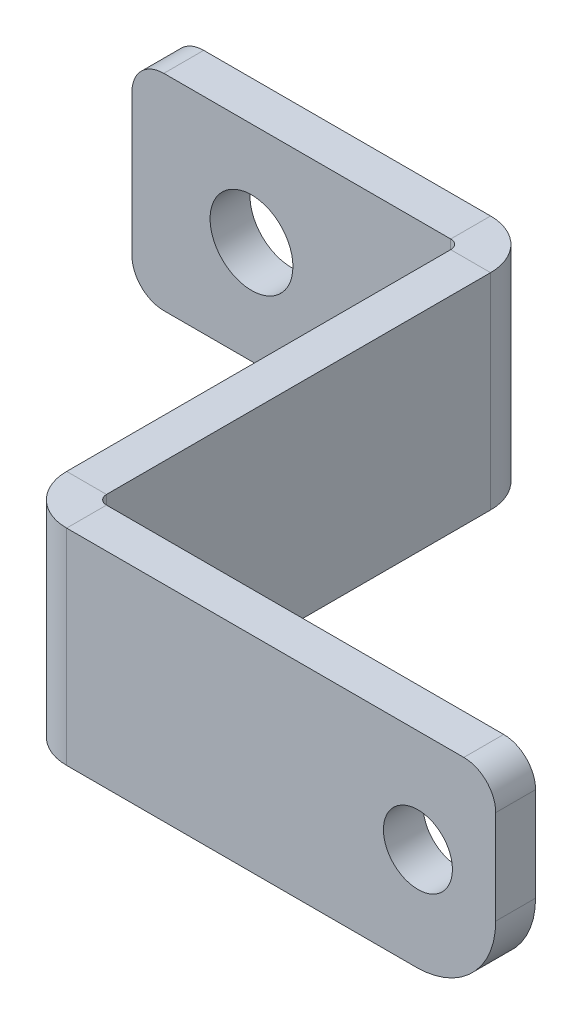
ISO-10303-21;
HEADER;
FILE_DESCRIPTION(('STEP AP214'),'2;1');
FILE_NAME('part.step','',(''),(''),'','','');
FILE_SCHEMA(('AUTOMOTIVE_DESIGN { 1 0 10303 214 1 1 1 1 }'));
ENDSEC;
DATA;
#1=APPLICATION_CONTEXT('core data for automotive mechanical design processes');
#2=APPLICATION_PROTOCOL_DEFINITION('international standard','automotive_design',2000,#1);
#3=PRODUCT_CONTEXT('',#1,'mechanical');
#4=PRODUCT('Part','Part','',(#3));
#5=PRODUCT_RELATED_PRODUCT_CATEGORY('part','',(#4));
#6=PRODUCT_DEFINITION_FORMATION('','',#4);
#7=PRODUCT_DEFINITION_CONTEXT('part definition',#1,'design');
#8=PRODUCT_DEFINITION('design','',#6,#7);
#9=PRODUCT_DEFINITION_SHAPE('','',#8);
#10=(LENGTH_UNIT() NAMED_UNIT(*) SI_UNIT(.MILLI.,.METRE.));
#11=(NAMED_UNIT(*) PLANE_ANGLE_UNIT() SI_UNIT($,.RADIAN.));
#12=(NAMED_UNIT(*) SI_UNIT($,.STERADIAN.) SOLID_ANGLE_UNIT());
#13=UNCERTAINTY_MEASURE_WITH_UNIT(LENGTH_MEASURE(1.E-05),#10,'distance_accuracy_value','');
#14=(GEOMETRIC_REPRESENTATION_CONTEXT(3) GLOBAL_UNCERTAINTY_ASSIGNED_CONTEXT((#13)) GLOBAL_UNIT_ASSIGNED_CONTEXT((#10,
#11,#12)) REPRESENTATION_CONTEXT('',''));
#15=CARTESIAN_POINT('',(0.,0.,0.));
#16=DIRECTION('',(0.,0.,1.));
#17=DIRECTION('',(1.,0.,0.));
#18=AXIS2_PLACEMENT_3D('',#15,#16,#17);
#19=CARTESIAN_POINT('',(65.8241,-45.5626000012021,0.));
#20=DIRECTION('',(0.,1.,0.));
#21=DIRECTION('',(0.,0.,1.));
#22=AXIS2_PLACEMENT_3D('',#19,#20,#21);
#23=PLANE('',#22);
#24=DIRECTION('',(-1.,0.,0.));
#25=VECTOR('',#24,1.);
#26=CARTESIAN_POINT('',(65.8241000000001,-45.5626000012021,31.3413));
#27=LINE('',#26,#25);
#28=CARTESIAN_POINT('',(65.8241000000001,-45.5626000012021,31.3413));
#29=VERTEX_POINT('',#28);
#30=CARTESIAN_POINT('',(62.6491000000001,-45.5626000012021,31.3413));
#31=VERTEX_POINT('',#30);
#32=EDGE_CURVE('E226',#29,#31,#27,.T.);
#33=ORIENTED_EDGE('',*,*,#32,.T.);
#34=DIRECTION('',(0.,0.,1.));
#35=VECTOR('',#34,1.);
#36=CARTESIAN_POINT('',(62.6491,-45.5626000012021,0.));
#37=LINE('',#36,#35);
#38=CARTESIAN_POINT('',(62.6491,-45.562600001202,0.736599999999997));
#39=VERTEX_POINT('',#38);
#40=EDGE_CURVE('E255',#31,#39,#37,.F.);
#41=ORIENTED_EDGE('',*,*,#40,.T.);
#42=DIRECTION('',(-1.,0.,0.));
#43=VECTOR('',#42,1.);
#44=CARTESIAN_POINT('',(65.8241,-45.5626000012021,0.736599999999986));
#45=LINE('',#44,#43);
#46=CARTESIAN_POINT('',(65.8241,-45.562600001202,0.736599999999986));
#47=VERTEX_POINT('',#46);
#48=EDGE_CURVE('E240',#39,#47,#45,.F.);
#49=ORIENTED_EDGE('',*,*,#48,.T.);
#50=DIRECTION('',(0.,0.,-1.));
#51=VECTOR('',#50,1.);
#52=CARTESIAN_POINT('',(65.8241,-45.5626000012021,-2.35221769799136E-13));
#53=LINE('',#52,#51);
#54=EDGE_CURVE('E248',#29,#47,#53,.T.);
#55=ORIENTED_EDGE('',*,*,#54,.F.);
#56=EDGE_LOOP('',(#33,#41,#49,#55));
#57=FACE_BOUND('',#56,.T.);
#58=ADVANCED_FACE('F60',(#57),#23,.F.);
#59=CARTESIAN_POINT('',(65.8241000000001,-29.1846000012021,32.0779));
#60=DIRECTION('',(0.,-1.,0.));
#61=DIRECTION('',(0.,0.,-1.));
#62=AXIS2_PLACEMENT_3D('',#59,#60,#61);
#63=PLANE('',#62);
#64=DIRECTION('',(-1.,0.,0.));
#65=VECTOR('',#64,1.);
#66=CARTESIAN_POINT('',(65.8241000000001,-29.1846000012021,31.3413));
#67=LINE('',#66,#65);
#68=CARTESIAN_POINT('',(65.8241000000001,-29.1846000012021,31.3413));
#69=VERTEX_POINT('',#68);
#70=CARTESIAN_POINT('',(62.6491000000001,-29.1846000012021,31.3413));
#71=VERTEX_POINT('',#70);
#72=EDGE_CURVE('E236',#69,#71,#67,.T.);
#73=ORIENTED_EDGE('',*,*,#72,.F.);
#74=DIRECTION('',(0.,0.,1.));
#75=VECTOR('',#74,1.);
#76=CARTESIAN_POINT('',(65.8241,-29.1846000012021,-2.22209432055311E-13));
#77=LINE('',#76,#75);
#78=CARTESIAN_POINT('',(65.8241,-29.1846000012021,0.736599999999986));
#79=VERTEX_POINT('',#78);
#80=EDGE_CURVE('E243',#79,#69,#77,.T.);
#81=ORIENTED_EDGE('',*,*,#80,.F.);
#82=DIRECTION('',(-1.,0.,0.));
#83=VECTOR('',#82,1.);
#84=CARTESIAN_POINT('',(62.6491,-29.1846000012021,0.736599999999997));
#85=LINE('',#84,#83);
#86=CARTESIAN_POINT('',(62.6491,-29.1846000012021,0.736599999999997));
#87=VERTEX_POINT('',#86);
#88=EDGE_CURVE('E262',#87,#79,#85,.F.);
#89=ORIENTED_EDGE('',*,*,#88,.F.);
#90=DIRECTION('',(0.,0.,-1.));
#91=VECTOR('',#90,1.);
#92=CARTESIAN_POINT('',(62.6491000000001,-29.1846000012021,32.0779));
#93=LINE('',#92,#91);
#94=EDGE_CURVE('E251',#87,#71,#93,.F.);
#95=ORIENTED_EDGE('',*,*,#94,.T.);
#96=EDGE_LOOP('',(#73,#81,#89,#95));
#97=FACE_BOUND('',#96,.T.);
#98=ADVANCED_FACE('F427',(#97),#63,.F.);
#99=CARTESIAN_POINT('',(65.8241,0.,-2.25365948582831E-13));
#100=DIRECTION('',(-1.,0.,0.));
#101=DIRECTION('',(0.,0.,1.));
#102=AXIS2_PLACEMENT_3D('',#99,#100,#101);
#103=PLANE('',#102);
#104=DIRECTION('',(0.,-1.,0.));
#105=VECTOR('',#104,1.);
#106=CARTESIAN_POINT('',(65.8241000000001,-45.5626000012021,31.3413));
#107=LINE('',#106,#105);
#108=EDGE_CURVE('E231',#29,#69,#107,.F.);
#109=ORIENTED_EDGE('',*,*,#108,.F.);
#110=ORIENTED_EDGE('',*,*,#54,.T.);
#111=DIRECTION('',(0.,1.,0.));
#112=VECTOR('',#111,1.);
#113=CARTESIAN_POINT('',(65.8241,-45.5626000012021,0.736599999999986));
#114=LINE('',#113,#112);
#115=EDGE_CURVE('E258',#79,#47,#114,.F.);
#116=ORIENTED_EDGE('',*,*,#115,.F.);
#117=ORIENTED_EDGE('',*,*,#80,.T.);
#118=EDGE_LOOP('',(#109,#110,#116,#117));
#119=FACE_BOUND('',#118,.T.);
#120=ADVANCED_FACE('F433',(#119),#103,.F.);
#121=CARTESIAN_POINT('',(62.6491,0.,-2.14280495332004E-13));
#122=DIRECTION('',(-1.,0.,0.));
#123=DIRECTION('',(0.,0.,1.));
#124=AXIS2_PLACEMENT_3D('',#121,#122,#123);
#125=PLANE('',#124);
#126=ORIENTED_EDGE('',*,*,#40,.F.);
#127=DIRECTION('',(0.,-1.,0.));
#128=VECTOR('',#127,1.);
#129=CARTESIAN_POINT('',(62.6491000000001,-45.5626000012021,31.3413));
#130=LINE('',#129,#128);
#131=EDGE_CURVE('E181',#31,#71,#130,.F.);
#132=ORIENTED_EDGE('',*,*,#131,.T.);
#133=ORIENTED_EDGE('',*,*,#94,.F.);
#134=DIRECTION('',(0.,1.,0.));
#135=VECTOR('',#134,1.);
#136=CARTESIAN_POINT('',(62.6491,-45.5626000012021,0.736599999999997));
#137=LINE('',#136,#135);
#138=EDGE_CURVE('E266',#39,#87,#137,.T.);
#139=ORIENTED_EDGE('',*,*,#138,.F.);
#140=EDGE_LOOP('',(#126,#132,#133,#139));
#141=FACE_BOUND('',#140,.T.);
#142=ADVANCED_FACE('F478',(#141),#125,.T.);
#143=CARTESIAN_POINT('',(36.5125,-29.1846000012021,-3.175));
#144=DIRECTION('',(0.,1.,0.));
#145=DIRECTION('',(0.,0.,1.));
#146=AXIS2_PLACEMENT_3D('',#143,#144,#145);
#147=PLANE('',#146);
#148=DIRECTION('',(-1.,0.,0.));
#149=VECTOR('',#148,1.);
#150=CARTESIAN_POINT('',(36.5125,-29.1846000012021,-3.175));
#151=LINE('',#150,#149);
#152=CARTESIAN_POINT('',(61.9125,-29.1846000012021,-3.175));
#153=VERTEX_POINT('',#152);
#154=CARTESIAN_POINT('',(39.0525,-29.1846000012021,-3.175));
#155=VERTEX_POINT('',#154);
#156=EDGE_CURVE('E296',#153,#155,#151,.T.);
#157=ORIENTED_EDGE('',*,*,#156,.T.);
#158=DIRECTION('',(0.,0.,1.));
#159=VECTOR('',#158,1.);
#160=CARTESIAN_POINT('',(39.0525,-29.1846000012021,-3.175));
#161=LINE('',#160,#159);
#162=CARTESIAN_POINT('',(39.0525,-29.1846000012021,0.));
#163=VERTEX_POINT('',#162);
#164=EDGE_CURVE('E355',#155,#163,#161,.T.);
#165=ORIENTED_EDGE('',*,*,#164,.T.);
#166=DIRECTION('',(-1.,0.,0.));
#167=VECTOR('',#166,1.);
#168=CARTESIAN_POINT('',(36.5125,-29.1846000012021,0.));
#169=LINE('',#168,#167);
#170=CARTESIAN_POINT('',(61.9125,-29.1846000012021,0.));
#171=VERTEX_POINT('',#170);
#172=EDGE_CURVE('E295',#171,#163,#169,.T.);
#173=ORIENTED_EDGE('',*,*,#172,.F.);
#174=DIRECTION('',(0.,0.,1.));
#175=VECTOR('',#174,1.);
#176=CARTESIAN_POINT('',(61.9125,-29.1846000012021,-3.175));
#177=LINE('',#176,#175);
#178=EDGE_CURVE('E326',#153,#171,#177,.T.);
#179=ORIENTED_EDGE('',*,*,#178,.F.);
#180=EDGE_LOOP('',(#157,#165,#173,#179));
#181=FACE_BOUND('',#180,.T.);
#182=ADVANCED_FACE('F471',(#181),#147,.T.);
#183=CARTESIAN_POINT('',(52.8905,-45.5626000012021,-3.175));
#184=DIRECTION('',(0.,-1.,0.));
#185=DIRECTION('',(1.,0.,0.));
#186=AXIS2_PLACEMENT_3D('',#183,#184,#185);
#187=PLANE('',#186);
#188=DIRECTION('',(1.,0.,0.));
#189=VECTOR('',#188,1.);
#190=CARTESIAN_POINT('',(52.8905,-45.5626000012021,0.));
#191=LINE('',#190,#189);
#192=CARTESIAN_POINT('',(39.0525,-45.5626000012021,0.));
#193=VERTEX_POINT('',#192);
#194=CARTESIAN_POINT('',(61.9125,-45.5626000012021,0.));
#195=VERTEX_POINT('',#194);
#196=EDGE_CURVE('E320',#193,#195,#191,.T.);
#197=ORIENTED_EDGE('',*,*,#196,.F.);
#198=DIRECTION('',(0.,0.,1.));
#199=VECTOR('',#198,1.);
#200=CARTESIAN_POINT('',(39.0525,-45.5626000012021,-3.175));
#201=LINE('',#200,#199);
#202=CARTESIAN_POINT('',(39.0525,-45.5626000012021,-3.175));
#203=VERTEX_POINT('',#202);
#204=EDGE_CURVE('E346',#193,#203,#201,.F.);
#205=ORIENTED_EDGE('',*,*,#204,.T.);
#206=DIRECTION('',(1.,0.,0.));
#207=VECTOR('',#206,1.);
#208=CARTESIAN_POINT('',(52.8905,-45.5626000012021,-3.175));
#209=LINE('',#208,#207);
#210=CARTESIAN_POINT('',(61.9125,-45.5626000012021,-3.175));
#211=VERTEX_POINT('',#210);
#212=EDGE_CURVE('E305',#203,#211,#209,.T.);
#213=ORIENTED_EDGE('',*,*,#212,.T.);
#214=DIRECTION('',(0.,0.,1.));
#215=VECTOR('',#214,1.);
#216=CARTESIAN_POINT('',(61.9125,-45.5626000012021,-3.175));
#217=LINE('',#216,#215);
#218=EDGE_CURVE('E312',#211,#195,#217,.T.);
#219=ORIENTED_EDGE('',*,*,#218,.T.);
#220=EDGE_LOOP('',(#197,#205,#213,#219));
#221=FACE_BOUND('',#220,.T.);
#222=ADVANCED_FACE('F468',(#221),#187,.T.);
#223=CARTESIAN_POINT('',(36.5125,-29.1846000012021,-3.175));
#224=DIRECTION('',(-1.,0.,0.));
#225=DIRECTION('',(0.,-1.,0.));
#226=AXIS2_PLACEMENT_3D('',#223,#224,#225);
#227=PLANE('',#226);
#228=DIRECTION('',(0.,-1.,0.));
#229=VECTOR('',#228,1.);
#230=CARTESIAN_POINT('',(36.5125,-29.1846000012021,-3.175));
#231=LINE('',#230,#229);
#232=CARTESIAN_POINT('',(36.5125,-31.7246000012021,-3.175));
#233=VERTEX_POINT('',#232);
#234=CARTESIAN_POINT('',(36.5125,-43.0226000012021,-3.175));
#235=VERTEX_POINT('',#234);
#236=EDGE_CURVE('E300',#233,#235,#231,.T.);
#237=ORIENTED_EDGE('',*,*,#236,.T.);
#238=DIRECTION('',(0.,0.,1.));
#239=VECTOR('',#238,1.);
#240=CARTESIAN_POINT('',(36.5125,-43.0226000012021,-3.175));
#241=LINE('',#240,#239);
#242=CARTESIAN_POINT('',(36.5125,-43.0226000012021,0.));
#243=VERTEX_POINT('',#242);
#244=EDGE_CURVE('E336',#235,#243,#241,.T.);
#245=ORIENTED_EDGE('',*,*,#244,.T.);
#246=DIRECTION('',(0.,-1.,0.));
#247=VECTOR('',#246,1.);
#248=CARTESIAN_POINT('',(36.5125,-29.1846000012021,0.));
#249=LINE('',#248,#247);
#250=CARTESIAN_POINT('',(36.5125,-31.7246000012021,0.));
#251=VERTEX_POINT('',#250);
#252=EDGE_CURVE('E316',#251,#243,#249,.T.);
#253=ORIENTED_EDGE('',*,*,#252,.F.);
#254=DIRECTION('',(0.,0.,1.));
#255=VECTOR('',#254,1.);
#256=CARTESIAN_POINT('',(36.5125,-31.7246000012021,-3.175));
#257=LINE('',#256,#255);
#258=EDGE_CURVE('E330',#251,#233,#257,.F.);
#259=ORIENTED_EDGE('',*,*,#258,.T.);
#260=EDGE_LOOP('',(#237,#245,#253,#259));
#261=FACE_BOUND('',#260,.T.);
#262=ADVANCED_FACE('F463',(#261),#227,.T.);
#263=CARTESIAN_POINT('',(0.,0.,-3.175));
#264=DIRECTION('',(0.,0.,1.));
#265=DIRECTION('',(1.,0.,0.));
#266=AXIS2_PLACEMENT_3D('',#263,#264,#265);
#267=PLANE('',#266);
#268=CARTESIAN_POINT('',(46.0375,-37.3736000012021,-3.175));
#269=DIRECTION('',(0.,0.,1.));
#270=DIRECTION('',(1.,0.,0.));
#271=AXIS2_PLACEMENT_3D('',#268,#269,#270);
#272=CIRCLE('',#271,3.3);
#273=CARTESIAN_POINT('',(49.3375,-37.3736000012021,-3.175));
#274=VERTEX_POINT('',#273);
#275=EDGE_CURVE('E291',#274,#274,#272,.T.);
#276=ORIENTED_EDGE('',*,*,#275,.T.);
#277=EDGE_LOOP('',(#276));
#278=FACE_BOUND('',#277,.T.);
#279=ORIENTED_EDGE('',*,*,#212,.F.);
#280=CARTESIAN_POINT('',(39.0525,-43.0226000012021,-3.175));
#281=DIRECTION('',(0.,0.,1.));
#282=DIRECTION('',(1.,0.,0.));
#283=AXIS2_PLACEMENT_3D('',#280,#281,#282);
#284=CIRCLE('',#283,2.54);
#285=EDGE_CURVE('E352',#203,#235,#284,.F.);
#286=ORIENTED_EDGE('',*,*,#285,.T.);
#287=ORIENTED_EDGE('',*,*,#236,.F.);
#288=CARTESIAN_POINT('',(39.0525,-31.7246000012021,-3.175));
#289=DIRECTION('',(0.,0.,1.));
#290=DIRECTION('',(1.,0.,0.));
#291=AXIS2_PLACEMENT_3D('',#288,#289,#290);
#292=CIRCLE('',#291,2.54);
#293=EDGE_CURVE('E349',#233,#155,#292,.F.);
#294=ORIENTED_EDGE('',*,*,#293,.T.);
#295=ORIENTED_EDGE('',*,*,#156,.F.);
#296=DIRECTION('',(0.,1.,0.));
#297=VECTOR('',#296,1.);
#298=CARTESIAN_POINT('',(61.9125,-45.5626000012021,-3.175));
#299=LINE('',#298,#297);
#300=EDGE_CURVE('E308',#211,#153,#299,.T.);
#301=ORIENTED_EDGE('',*,*,#300,.F.);
#302=EDGE_LOOP('',(#279,#286,#287,#294,#295,#301));
#303=FACE_BOUND('',#302,.T.);
#304=ADVANCED_FACE('F460',(#278,#303),#267,.F.);
#305=CARTESIAN_POINT('',(0.,0.,0.));
#306=DIRECTION('',(0.,0.,1.));
#307=DIRECTION('',(1.,0.,0.));
#308=AXIS2_PLACEMENT_3D('',#305,#306,#307);
#309=PLANE('',#308);
#310=CARTESIAN_POINT('',(46.0375,-37.3736000012021,0.));
#311=DIRECTION('',(0.,0.,1.));
#312=DIRECTION('',(1.,0.,0.));
#313=AXIS2_PLACEMENT_3D('',#310,#311,#312);
#314=CIRCLE('',#313,3.3);
#315=CARTESIAN_POINT('',(49.3375,-37.3736000012021,0.));
#316=VERTEX_POINT('',#315);
#317=EDGE_CURVE('E276',#316,#316,#314,.T.);
#318=ORIENTED_EDGE('',*,*,#317,.F.);
#319=EDGE_LOOP('',(#318));
#320=FACE_BOUND('',#319,.T.);
#321=ORIENTED_EDGE('',*,*,#252,.T.);
#322=CARTESIAN_POINT('',(39.0525,-43.0226000012021,0.));
#323=DIRECTION('',(0.,0.,1.));
#324=DIRECTION('',(1.,0.,0.));
#325=AXIS2_PLACEMENT_3D('',#322,#323,#324);
#326=CIRCLE('',#325,2.54);
#327=EDGE_CURVE('E343',#243,#193,#326,.T.);
#328=ORIENTED_EDGE('',*,*,#327,.T.);
#329=ORIENTED_EDGE('',*,*,#196,.T.);
#330=DIRECTION('',(0.,1.,0.));
#331=VECTOR('',#330,1.);
#332=CARTESIAN_POINT('',(61.9125,-45.5626000012021,0.));
#333=LINE('',#332,#331);
#334=EDGE_CURVE('E301',#195,#171,#333,.T.);
#335=ORIENTED_EDGE('',*,*,#334,.T.);
#336=ORIENTED_EDGE('',*,*,#172,.T.);
#337=CARTESIAN_POINT('',(39.0525,-31.7246000012021,0.));
#338=DIRECTION('',(0.,0.,1.));
#339=DIRECTION('',(1.,0.,0.));
#340=AXIS2_PLACEMENT_3D('',#337,#338,#339);
#341=CIRCLE('',#340,2.54);
#342=EDGE_CURVE('E340',#163,#251,#341,.T.);
#343=ORIENTED_EDGE('',*,*,#342,.T.);
#344=EDGE_LOOP('',(#321,#328,#329,#335,#336,#343));
#345=FACE_BOUND('',#344,.T.);
#346=ADVANCED_FACE('F458',(#320,#345),#309,.T.);
#347=CARTESIAN_POINT('',(46.0375,-37.3736000012021,0.));
#348=DIRECTION('',(0.,0.,1.));
#349=DIRECTION('',(1.,0.,0.));
#350=AXIS2_PLACEMENT_3D('',#347,#348,#349);
#351=CYLINDRICAL_SURFACE('',#350,3.3);
#352=ORIENTED_EDGE('',*,*,#275,.F.);
#353=EDGE_LOOP('',(#352));
#354=FACE_BOUND('',#353,.T.);
#355=ORIENTED_EDGE('',*,*,#317,.T.);
#356=EDGE_LOOP('',(#355));
#357=FACE_BOUND('',#356,.T.);
#358=ADVANCED_FACE('F451',(#354,#357),#351,.F.);
#359=CARTESIAN_POINT('',(61.9125,-45.562600001202,0.7366));
#360=DIRECTION('',(0.,-1.,0.));
#361=DIRECTION('',(0.,0.,-1.));
#362=AXIS2_PLACEMENT_3D('',#359,#360,#361);
#363=PLANE('',#362);
#364=ORIENTED_EDGE('',*,*,#48,.F.);
#365=CARTESIAN_POINT('',(61.9125,-45.562600001202,0.7366));
#366=DIRECTION('',(0.,1.,0.));
#367=DIRECTION('',(0.,0.,1.));
#368=AXIS2_PLACEMENT_3D('',#365,#366,#367);
#369=CIRCLE('',#368,0.736599999999997);
#370=EDGE_CURVE('E281',#195,#39,#369,.F.);
#371=ORIENTED_EDGE('',*,*,#370,.F.);
#372=ORIENTED_EDGE('',*,*,#218,.F.);
#373=CARTESIAN_POINT('',(61.9125,-45.562600001202,0.7366));
#374=DIRECTION('',(0.,1.,0.));
#375=DIRECTION('',(0.,0.,1.));
#376=AXIS2_PLACEMENT_3D('',#373,#374,#375);
#377=CIRCLE('',#376,3.9116);
#378=EDGE_CURVE('E272',#211,#47,#377,.F.);
#379=ORIENTED_EDGE('',*,*,#378,.T.);
#380=EDGE_LOOP('',(#364,#371,#372,#379));
#381=FACE_BOUND('',#380,.T.);
#382=ADVANCED_FACE('F448',(#381),#363,.T.);
#383=CARTESIAN_POINT('',(61.9125,-29.1846000012021,0.7366));
#384=DIRECTION('',(0.,-1.,0.));
#385=DIRECTION('',(0.,0.,-1.));
#386=AXIS2_PLACEMENT_3D('',#383,#384,#385);
#387=PLANE('',#386);
#388=CARTESIAN_POINT('',(61.9125,-29.1846000012021,0.7366));
#389=DIRECTION('',(0.,1.,0.));
#390=DIRECTION('',(0.,0.,1.));
#391=AXIS2_PLACEMENT_3D('',#388,#389,#390);
#392=CIRCLE('',#391,0.736599999999997);
#393=EDGE_CURVE('E247',#87,#171,#392,.T.);
#394=ORIENTED_EDGE('',*,*,#393,.F.);
#395=ORIENTED_EDGE('',*,*,#88,.T.);
#396=CARTESIAN_POINT('',(61.9125,-29.1846000012021,0.7366));
#397=DIRECTION('',(0.,1.,0.));
#398=DIRECTION('',(0.,0.,1.));
#399=AXIS2_PLACEMENT_3D('',#396,#397,#398);
#400=CIRCLE('',#399,3.9116);
#401=EDGE_CURVE('E277',#79,#153,#400,.T.);
#402=ORIENTED_EDGE('',*,*,#401,.T.);
#403=ORIENTED_EDGE('',*,*,#178,.T.);
#404=EDGE_LOOP('',(#394,#395,#402,#403));
#405=FACE_BOUND('',#404,.T.);
#406=ADVANCED_FACE('F442',(#405),#387,.F.);
#407=CARTESIAN_POINT('',(61.9125,-29.1846000012021,0.7366));
#408=DIRECTION('',(0.,1.,0.));
#409=DIRECTION('',(1.,0.,0.));
#410=AXIS2_PLACEMENT_3D('',#407,#408,#409);
#411=CYLINDRICAL_SURFACE('',#410,3.9116);
#412=ORIENTED_EDGE('',*,*,#300,.T.);
#413=ORIENTED_EDGE('',*,*,#401,.F.);
#414=ORIENTED_EDGE('',*,*,#115,.T.);
#415=ORIENTED_EDGE('',*,*,#378,.F.);
#416=EDGE_LOOP('',(#412,#413,#414,#415));
#417=FACE_BOUND('',#416,.T.);
#418=ADVANCED_FACE('F438',(#417),#411,.T.);
#419=CARTESIAN_POINT('',(61.9125,-29.1846000012021,0.7366));
#420=DIRECTION('',(0.,1.,0.));
#421=DIRECTION('',(1.,0.,0.));
#422=AXIS2_PLACEMENT_3D('',#419,#420,#421);
#423=CYLINDRICAL_SURFACE('',#422,0.736599999999997);
#424=ORIENTED_EDGE('',*,*,#334,.F.);
#425=ORIENTED_EDGE('',*,*,#370,.T.);
#426=ORIENTED_EDGE('',*,*,#138,.T.);
#427=ORIENTED_EDGE('',*,*,#393,.T.);
#428=EDGE_LOOP('',(#424,#425,#426,#427));
#429=FACE_BOUND('',#428,.T.);
#430=ADVANCED_FACE('F441',(#429),#423,.F.);
#431=CARTESIAN_POINT('',(66.5607000000001,-29.1846000012021,31.3413));
#432=DIRECTION('',(0.,1.,0.));
#433=DIRECTION('',(0.,0.,1.));
#434=AXIS2_PLACEMENT_3D('',#431,#432,#433);
#435=PLANE('',#434);
#436=DIRECTION('',(0.,0.,1.));
#437=VECTOR('',#436,1.);
#438=CARTESIAN_POINT('',(66.5607000000001,-29.1846000012021,32.0779));
#439=LINE('',#438,#437);
#440=CARTESIAN_POINT('',(66.5607000000001,-29.1846000012021,32.0779));
#441=VERTEX_POINT('',#440);
#442=CARTESIAN_POINT('',(66.5607000000001,-29.1846000012021,35.2529));
#443=VERTEX_POINT('',#442);
#444=EDGE_CURVE('E397',#441,#443,#439,.T.);
#445=ORIENTED_EDGE('',*,*,#444,.F.);
#446=CARTESIAN_POINT('',(66.5607000000001,-29.1846000012021,31.3413));
#447=DIRECTION('',(0.,-1.,0.));
#448=DIRECTION('',(0.,0.,-1.));
#449=AXIS2_PLACEMENT_3D('',#446,#447,#448);
#450=CIRCLE('',#449,0.736599999999997);
#451=EDGE_CURVE('E185',#69,#441,#450,.F.);
#452=ORIENTED_EDGE('',*,*,#451,.F.);
#453=ORIENTED_EDGE('',*,*,#72,.T.);
#454=CARTESIAN_POINT('',(66.5607000000001,-29.1846000012021,31.3413));
#455=DIRECTION('',(0.,-1.,0.));
#456=DIRECTION('',(0.,0.,-1.));
#457=AXIS2_PLACEMENT_3D('',#454,#455,#456);
#458=CIRCLE('',#457,3.9116);
#459=EDGE_CURVE('E224',#71,#443,#458,.F.);
#460=ORIENTED_EDGE('',*,*,#459,.T.);
#461=EDGE_LOOP('',(#445,#452,#453,#460));
#462=FACE_BOUND('',#461,.T.);
#463=ADVANCED_FACE('F446',(#462),#435,.T.);
#464=CARTESIAN_POINT('',(66.5607000000001,-45.5626000012021,31.3413));
#465=DIRECTION('',(0.,1.,0.));
#466=DIRECTION('',(0.,0.,1.));
#467=AXIS2_PLACEMENT_3D('',#464,#465,#466);
#468=PLANE('',#467);
#469=CARTESIAN_POINT('',(66.5607000000001,-45.5626000012021,31.3413));
#470=DIRECTION('',(0.,-1.,0.));
#471=DIRECTION('',(0.,0.,-1.));
#472=AXIS2_PLACEMENT_3D('',#469,#470,#471);
#473=CIRCLE('',#472,0.736599999999997);
#474=CARTESIAN_POINT('',(66.5607000000001,-45.5626000012021,32.0779));
#475=VERTEX_POINT('',#474);
#476=EDGE_CURVE('E192',#475,#29,#473,.T.);
#477=ORIENTED_EDGE('',*,*,#476,.F.);
#478=DIRECTION('',(0.,0.,1.));
#479=VECTOR('',#478,1.);
#480=CARTESIAN_POINT('',(66.5607000000001,-45.5626000012021,32.0779));
#481=LINE('',#480,#479);
#482=CARTESIAN_POINT('',(66.5607000000001,-45.5626000012021,35.2529));
#483=VERTEX_POINT('',#482);
#484=EDGE_CURVE('E189',#475,#483,#481,.T.);
#485=ORIENTED_EDGE('',*,*,#484,.T.);
#486=CARTESIAN_POINT('',(66.5607000000001,-45.5626000012021,31.3413));
#487=DIRECTION('',(0.,-1.,0.));
#488=DIRECTION('',(0.,0.,-1.));
#489=AXIS2_PLACEMENT_3D('',#486,#487,#488);
#490=CIRCLE('',#489,3.9116);
#491=EDGE_CURVE('E174',#483,#31,#490,.T.);
#492=ORIENTED_EDGE('',*,*,#491,.T.);
#493=ORIENTED_EDGE('',*,*,#32,.F.);
#494=EDGE_LOOP('',(#477,#485,#492,#493));
#495=FACE_BOUND('',#494,.T.);
#496=ADVANCED_FACE('F190',(#495),#468,.F.);
#497=CARTESIAN_POINT('',(66.5607000000001,-45.5626000012021,31.3413));
#498=DIRECTION('',(0.,-1.,0.));
#499=DIRECTION('',(0.,0.,1.));
#500=AXIS2_PLACEMENT_3D('',#497,#498,#499);
#501=CYLINDRICAL_SURFACE('',#500,3.9116);
#502=ORIENTED_EDGE('',*,*,#131,.F.);
#503=ORIENTED_EDGE('',*,*,#491,.F.);
#504=DIRECTION('',(0.,1.,0.));
#505=VECTOR('',#504,1.);
#506=CARTESIAN_POINT('',(66.5607000000001,0.,35.2529));
#507=LINE('',#506,#505);
#508=EDGE_CURVE('E178',#483,#443,#507,.T.);
#509=ORIENTED_EDGE('',*,*,#508,.T.);
#510=ORIENTED_EDGE('',*,*,#459,.F.);
#511=EDGE_LOOP('',(#502,#503,#509,#510));
#512=FACE_BOUND('',#511,.T.);
#513=ADVANCED_FACE('F176',(#512),#501,.T.);
#514=CARTESIAN_POINT('',(66.5607000000001,-45.5626000012021,31.3413));
#515=DIRECTION('',(0.,-1.,0.));
#516=DIRECTION('',(0.,0.,1.));
#517=AXIS2_PLACEMENT_3D('',#514,#515,#516);
#518=CYLINDRICAL_SURFACE('',#517,0.736599999999997);
#519=ORIENTED_EDGE('',*,*,#108,.T.);
#520=ORIENTED_EDGE('',*,*,#451,.T.);
#521=DIRECTION('',(0.,-1.,0.));
#522=VECTOR('',#521,1.);
#523=CARTESIAN_POINT('',(66.5607000000001,-29.1846000012021,32.0779));
#524=LINE('',#523,#522);
#525=EDGE_CURVE('E194',#441,#475,#524,.T.);
#526=ORIENTED_EDGE('',*,*,#525,.T.);
#527=ORIENTED_EDGE('',*,*,#476,.T.);
#528=EDGE_LOOP('',(#519,#520,#526,#527));
#529=FACE_BOUND('',#528,.T.);
#530=ADVANCED_FACE('F548',(#529),#518,.F.);
#531=CARTESIAN_POINT('',(65.8241000000001,-29.1846000012021,35.2529));
#532=DIRECTION('',(0.,-1.,0.));
#533=DIRECTION('',(0.,0.,-1.));
#534=AXIS2_PLACEMENT_3D('',#531,#532,#533);
#535=PLANE('',#534);
#536=DIRECTION('',(-1.,0.,0.));
#537=VECTOR('',#536,1.);
#538=CARTESIAN_POINT('',(65.8241000000001,-29.1846000012021,35.2529));
#539=LINE('',#538,#537);
#540=CARTESIAN_POINT('',(98.2091000000001,-29.1846000012021,35.2529));
#541=VERTEX_POINT('',#540);
#542=EDGE_CURVE('E201',#541,#443,#539,.T.);
#543=ORIENTED_EDGE('',*,*,#542,.F.);
#544=DIRECTION('',(0.,0.,-1.));
#545=VECTOR('',#544,1.);
#546=CARTESIAN_POINT('',(98.2091000000001,-29.1846000012021,35.2529));
#547=LINE('',#546,#545);
#548=CARTESIAN_POINT('',(98.2091000000001,-29.1846000012021,32.0779));
#549=VERTEX_POINT('',#548);
#550=EDGE_CURVE('E359',#541,#549,#547,.T.);
#551=ORIENTED_EDGE('',*,*,#550,.T.);
#552=DIRECTION('',(-1.,0.,0.));
#553=VECTOR('',#552,1.);
#554=CARTESIAN_POINT('',(65.8241000000001,-29.1846000012021,32.0779));
#555=LINE('',#554,#553);
#556=EDGE_CURVE('E203',#549,#441,#555,.T.);
#557=ORIENTED_EDGE('',*,*,#556,.T.);
#558=ORIENTED_EDGE('',*,*,#444,.T.);
#559=EDGE_LOOP('',(#543,#551,#557,#558));
#560=FACE_BOUND('',#559,.T.);
#561=ADVANCED_FACE('F395',(#560),#535,.F.);
#562=CARTESIAN_POINT('',(100.7491,-45.5626000012021,35.2529));
#563=DIRECTION('',(0.,1.,0.));
#564=DIRECTION('',(0.,0.,1.));
#565=AXIS2_PLACEMENT_3D('',#562,#563,#564);
#566=PLANE('',#565);
#567=DIRECTION('',(1.,0.,0.));
#568=VECTOR('',#567,1.);
#569=CARTESIAN_POINT('',(100.7491,-45.5626000012021,32.0779));
#570=LINE('',#569,#568);
#571=CARTESIAN_POINT('',(94.3991000000001,-45.5626000012021,32.0779));
#572=VERTEX_POINT('',#571);
#573=EDGE_CURVE('E217',#475,#572,#570,.T.);
#574=ORIENTED_EDGE('',*,*,#573,.T.);
#575=DIRECTION('',(0.,0.,-1.));
#576=VECTOR('',#575,1.);
#577=CARTESIAN_POINT('',(94.3991000000001,-45.5626000012021,35.2529));
#578=LINE('',#577,#576);
#579=CARTESIAN_POINT('',(94.3991000000001,-45.5626000012021,35.2529));
#580=VERTEX_POINT('',#579);
#581=EDGE_CURVE('E69',#572,#580,#578,.F.);
#582=ORIENTED_EDGE('',*,*,#581,.T.);
#583=DIRECTION('',(1.,0.,0.));
#584=VECTOR('',#583,1.);
#585=CARTESIAN_POINT('',(100.7491,-45.5626000012021,35.2529));
#586=LINE('',#585,#584);
#587=EDGE_CURVE('E198',#483,#580,#586,.T.);
#588=ORIENTED_EDGE('',*,*,#587,.F.);
#589=ORIENTED_EDGE('',*,*,#484,.F.);
#590=EDGE_LOOP('',(#574,#582,#588,#589));
#591=FACE_BOUND('',#590,.T.);
#592=ADVANCED_FACE('F205',(#591),#566,.F.);
#593=CARTESIAN_POINT('',(0.,0.,35.2529));
#594=DIRECTION('',(0.,0.,-1.));
#595=DIRECTION('',(-1.,0.,0.));
#596=AXIS2_PLACEMENT_3D('',#593,#594,#595);
#597=PLANE('',#596);
#598=CARTESIAN_POINT('',(94.5499000000038,-37.373600001202,35.2529));
#599=DIRECTION('',(0.,0.,1.));
#600=DIRECTION('',(1.,0.,0.));
#601=AXIS2_PLACEMENT_3D('',#598,#599,#600);
#602=CIRCLE('',#601,2.75);
#603=CARTESIAN_POINT('',(97.2999000000038,-37.373600001202,35.2529));
#604=VERTEX_POINT('',#603);
#605=EDGE_CURVE('E407',#604,#604,#602,.T.);
#606=ORIENTED_EDGE('',*,*,#605,.F.);
#607=EDGE_LOOP('',(#606));
#608=FACE_BOUND('',#607,.T.);
#609=ORIENTED_EDGE('',*,*,#587,.T.);
#610=CARTESIAN_POINT('',(94.3991000000001,-39.2126000012021,35.2529));
#611=DIRECTION('',(0.,0.,-1.));
#612=DIRECTION('',(-1.,0.,0.));
#613=AXIS2_PLACEMENT_3D('',#610,#611,#612);
#614=CIRCLE('',#613,6.35);
#615=CARTESIAN_POINT('',(100.7491,-39.2126000012021,35.2529));
#616=VERTEX_POINT('',#615);
#617=EDGE_CURVE('E13',#580,#616,#614,.F.);
#618=ORIENTED_EDGE('',*,*,#617,.T.);
#619=DIRECTION('',(0.,1.,0.));
#620=VECTOR('',#619,1.);
#621=CARTESIAN_POINT('',(100.7491,-29.1846000012021,35.2529));
#622=LINE('',#621,#620);
#623=CARTESIAN_POINT('',(100.7491,-31.7246000012021,35.2529));
#624=VERTEX_POINT('',#623);
#625=EDGE_CURVE('E207',#616,#624,#622,.T.);
#626=ORIENTED_EDGE('',*,*,#625,.T.);
#627=CARTESIAN_POINT('',(98.2091000000001,-31.7246000012021,35.2529));
#628=DIRECTION('',(0.,0.,-1.));
#629=DIRECTION('',(-1.,0.,0.));
#630=AXIS2_PLACEMENT_3D('',#627,#628,#629);
#631=CIRCLE('',#630,2.54);
#632=EDGE_CURVE('E371',#624,#541,#631,.F.);
#633=ORIENTED_EDGE('',*,*,#632,.T.);
#634=ORIENTED_EDGE('',*,*,#542,.T.);
#635=ORIENTED_EDGE('',*,*,#508,.F.);
#636=EDGE_LOOP('',(#609,#618,#626,#633,#634,#635));
#637=FACE_BOUND('',#636,.T.);
#638=ADVANCED_FACE('F197',(#608,#637),#597,.F.);
#639=CARTESIAN_POINT('',(0.,0.,32.0779));
#640=DIRECTION('',(0.,0.,-1.));
#641=DIRECTION('',(-1.,0.,0.));
#642=AXIS2_PLACEMENT_3D('',#639,#640,#641);
#643=PLANE('',#642);
#644=CARTESIAN_POINT('',(94.5499000000038,-37.373600001202,32.0779));
#645=DIRECTION('',(0.,0.,-1.));
#646=DIRECTION('',(-1.,0.,0.));
#647=AXIS2_PLACEMENT_3D('',#644,#645,#646);
#648=CIRCLE('',#647,2.75);
#649=CARTESIAN_POINT('',(91.7999000000038,-37.373600001202,32.0779));
#650=VERTEX_POINT('',#649);
#651=EDGE_CURVE('E401',#650,#650,#648,.T.);
#652=ORIENTED_EDGE('',*,*,#651,.F.);
#653=EDGE_LOOP('',(#652));
#654=FACE_BOUND('',#653,.T.);
#655=DIRECTION('',(0.,1.,0.));
#656=VECTOR('',#655,1.);
#657=CARTESIAN_POINT('',(100.7491,-29.1846000012021,32.0779));
#658=LINE('',#657,#656);
#659=CARTESIAN_POINT('',(100.7491,-39.2126000012021,32.0779));
#660=VERTEX_POINT('',#659);
#661=CARTESIAN_POINT('',(100.7491,-31.7246000012021,32.0779));
#662=VERTEX_POINT('',#661);
#663=EDGE_CURVE('E212',#660,#662,#658,.T.);
#664=ORIENTED_EDGE('',*,*,#663,.F.);
#665=CARTESIAN_POINT('',(94.3991000000001,-39.2126000012021,32.0779));
#666=DIRECTION('',(0.,0.,-1.));
#667=DIRECTION('',(-1.,0.,0.));
#668=AXIS2_PLACEMENT_3D('',#665,#666,#667);
#669=CIRCLE('',#668,6.35);
#670=EDGE_CURVE('E83',#660,#572,#669,.T.);
#671=ORIENTED_EDGE('',*,*,#670,.T.);
#672=ORIENTED_EDGE('',*,*,#573,.F.);
#673=ORIENTED_EDGE('',*,*,#525,.F.);
#674=ORIENTED_EDGE('',*,*,#556,.F.);
#675=CARTESIAN_POINT('',(98.2091000000001,-31.7246000012021,32.0779));
#676=DIRECTION('',(0.,0.,-1.));
#677=DIRECTION('',(-1.,0.,0.));
#678=AXIS2_PLACEMENT_3D('',#675,#676,#677);
#679=CIRCLE('',#678,2.54);
#680=EDGE_CURVE('E363',#549,#662,#679,.T.);
#681=ORIENTED_EDGE('',*,*,#680,.T.);
#682=EDGE_LOOP('',(#664,#671,#672,#673,#674,#681));
#683=FACE_BOUND('',#682,.T.);
#684=ADVANCED_FACE('F385',(#654,#683),#643,.T.);
#685=CARTESIAN_POINT('',(100.7491,-29.1846000012021,35.2529));
#686=DIRECTION('',(-1.,0.,0.));
#687=DIRECTION('',(0.,0.,1.));
#688=AXIS2_PLACEMENT_3D('',#685,#686,#687);
#689=PLANE('',#688);
#690=ORIENTED_EDGE('',*,*,#625,.F.);
#691=DIRECTION('',(0.,0.,-1.));
#692=VECTOR('',#691,1.);
#693=CARTESIAN_POINT('',(100.7491,-39.2126000012021,35.2529));
#694=LINE('',#693,#692);
#695=EDGE_CURVE('E374',#616,#660,#694,.T.);
#696=ORIENTED_EDGE('',*,*,#695,.T.);
#697=ORIENTED_EDGE('',*,*,#663,.T.);
#698=DIRECTION('',(0.,0.,-1.));
#699=VECTOR('',#698,1.);
#700=CARTESIAN_POINT('',(100.7491,-31.7246000012021,35.2529));
#701=LINE('',#700,#699);
#702=EDGE_CURVE('E367',#662,#624,#701,.F.);
#703=ORIENTED_EDGE('',*,*,#702,.T.);
#704=EDGE_LOOP('',(#690,#696,#697,#703));
#705=FACE_BOUND('',#704,.T.);
#706=ADVANCED_FACE('F383',(#705),#689,.F.);
#707=CARTESIAN_POINT('',(94.5499000000038,-37.373600001202,35.2529));
#708=DIRECTION('',(0.,0.,1.));
#709=DIRECTION('',(1.,0.,0.));
#710=AXIS2_PLACEMENT_3D('',#707,#708,#709);
#711=CYLINDRICAL_SURFACE('',#710,2.75);
#712=ORIENTED_EDGE('',*,*,#651,.T.);
#713=EDGE_LOOP('',(#712));
#714=FACE_BOUND('',#713,.T.);
#715=ORIENTED_EDGE('',*,*,#605,.T.);
#716=EDGE_LOOP('',(#715));
#717=FACE_BOUND('',#716,.T.);
#718=ADVANCED_FACE('F414',(#714,#717),#711,.F.);
#719=CARTESIAN_POINT('',(39.0525,-43.0226000012021,-3.175));
#720=DIRECTION('',(0.,0.,1.));
#721=DIRECTION('',(1.,0.,0.));
#722=AXIS2_PLACEMENT_3D('',#719,#720,#721);
#723=CYLINDRICAL_SURFACE('',#722,2.54);
#724=ORIENTED_EDGE('',*,*,#285,.F.);
#725=ORIENTED_EDGE('',*,*,#204,.F.);
#726=ORIENTED_EDGE('',*,*,#327,.F.);
#727=ORIENTED_EDGE('',*,*,#244,.F.);
#728=EDGE_LOOP('',(#724,#725,#726,#727));
#729=FACE_BOUND('',#728,.T.);
#730=ADVANCED_FACE('F480',(#729),#723,.T.);
#731=CARTESIAN_POINT('',(39.0525,-31.7246000012021,-3.175));
#732=DIRECTION('',(0.,0.,1.));
#733=DIRECTION('',(1.,0.,0.));
#734=AXIS2_PLACEMENT_3D('',#731,#732,#733);
#735=CYLINDRICAL_SURFACE('',#734,2.54);
#736=ORIENTED_EDGE('',*,*,#293,.F.);
#737=ORIENTED_EDGE('',*,*,#258,.F.);
#738=ORIENTED_EDGE('',*,*,#342,.F.);
#739=ORIENTED_EDGE('',*,*,#164,.F.);
#740=EDGE_LOOP('',(#736,#737,#738,#739));
#741=FACE_BOUND('',#740,.T.);
#742=ADVANCED_FACE('F483',(#741),#735,.T.);
#743=CARTESIAN_POINT('',(98.2091000000001,-31.7246000012021,35.2529));
#744=DIRECTION('',(0.,0.,-1.));
#745=DIRECTION('',(-1.,0.,0.));
#746=AXIS2_PLACEMENT_3D('',#743,#744,#745);
#747=CYLINDRICAL_SURFACE('',#746,2.54);
#748=ORIENTED_EDGE('',*,*,#632,.F.);
#749=ORIENTED_EDGE('',*,*,#702,.F.);
#750=ORIENTED_EDGE('',*,*,#680,.F.);
#751=ORIENTED_EDGE('',*,*,#550,.F.);
#752=EDGE_LOOP('',(#748,#749,#750,#751));
#753=FACE_BOUND('',#752,.T.);
#754=ADVANCED_FACE('F392',(#753),#747,.T.);
#755=CARTESIAN_POINT('',(94.3991000000001,-39.2126000012021,35.2529));
#756=DIRECTION('',(0.,0.,-1.));
#757=DIRECTION('',(-1.,0.,0.));
#758=AXIS2_PLACEMENT_3D('',#755,#756,#757);
#759=CYLINDRICAL_SURFACE('',#758,6.35);
#760=ORIENTED_EDGE('',*,*,#617,.F.);
#761=ORIENTED_EDGE('',*,*,#581,.F.);
#762=ORIENTED_EDGE('',*,*,#670,.F.);
#763=ORIENTED_EDGE('',*,*,#695,.F.);
#764=EDGE_LOOP('',(#760,#761,#762,#763));
#765=FACE_BOUND('',#764,.T.);
#766=ADVANCED_FACE('F62',(#765),#759,.T.);
#767=CLOSED_SHELL('',(#58,#98,#120,#142,#182,#222,#262,#304,#346,#358,#382,#406,#418,#430,#463,
#496,#513,#530,#561,#592,#638,#684,#706,#718,#730,#742,#754,#766));
#768=MANIFOLD_SOLID_BREP('B2',#767);
#769=ADVANCED_BREP_SHAPE_REPRESENTATION('',(#18,#768),#14);
#770=SHAPE_DEFINITION_REPRESENTATION(#9,#769);
ENDSEC;
END-ISO-10303-21;
